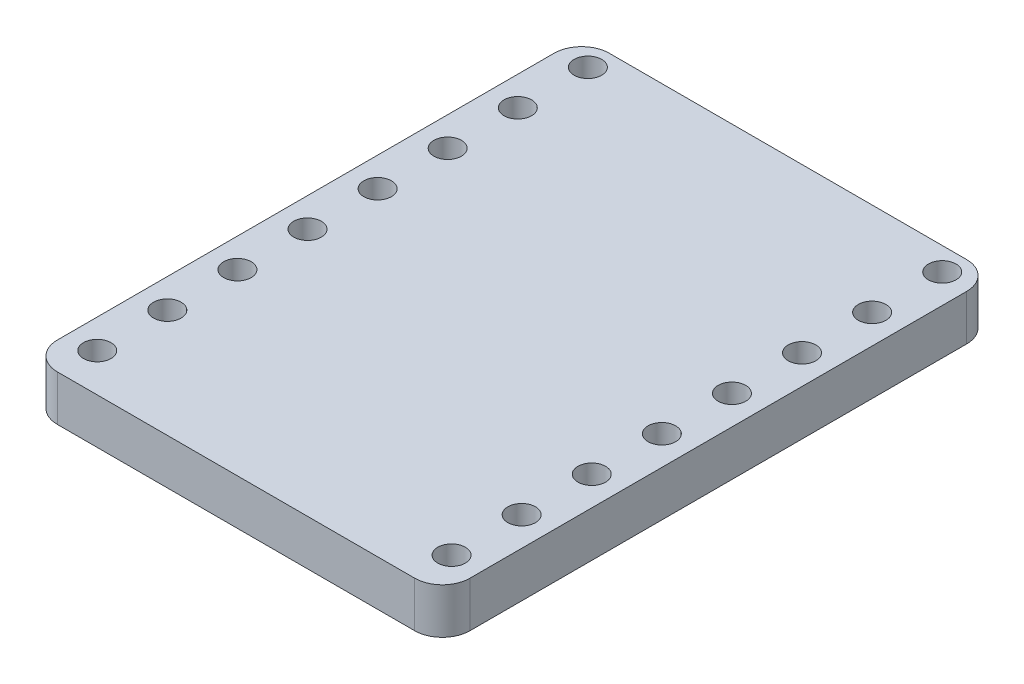
ISO-10303-21;
HEADER;
FILE_DESCRIPTION(('STEP AP214'),'2;1');
FILE_NAME('part.step','',(''),(''),'','','');
FILE_SCHEMA(('AUTOMOTIVE_DESIGN { 1 0 10303 214 1 1 1 1 }'));
ENDSEC;
DATA;
#1=APPLICATION_CONTEXT('core data for automotive mechanical design processes');
#2=APPLICATION_PROTOCOL_DEFINITION('international standard','automotive_design',2000,#1);
#3=PRODUCT_CONTEXT('',#1,'mechanical');
#4=PRODUCT('Part','Part','',(#3));
#5=PRODUCT_RELATED_PRODUCT_CATEGORY('part','',(#4));
#6=PRODUCT_DEFINITION_FORMATION('','',#4);
#7=PRODUCT_DEFINITION_CONTEXT('part definition',#1,'design');
#8=PRODUCT_DEFINITION('design','',#6,#7);
#9=PRODUCT_DEFINITION_SHAPE('','',#8);
#10=(LENGTH_UNIT() NAMED_UNIT(*) SI_UNIT(.MILLI.,.METRE.));
#11=(NAMED_UNIT(*) PLANE_ANGLE_UNIT() SI_UNIT($,.RADIAN.));
#12=(NAMED_UNIT(*) SI_UNIT($,.STERADIAN.) SOLID_ANGLE_UNIT());
#13=UNCERTAINTY_MEASURE_WITH_UNIT(LENGTH_MEASURE(1.E-05),#10,'distance_accuracy_value','');
#14=(GEOMETRIC_REPRESENTATION_CONTEXT(3) GLOBAL_UNCERTAINTY_ASSIGNED_CONTEXT((#13)) GLOBAL_UNIT_ASSIGNED_CONTEXT((#10,
#11,#12)) REPRESENTATION_CONTEXT('',''));
#15=CARTESIAN_POINT('',(0.,0.,0.));
#16=DIRECTION('',(0.,0.,1.));
#17=DIRECTION('',(1.,0.,0.));
#18=AXIS2_PLACEMENT_3D('',#15,#16,#17);
#19=CARTESIAN_POINT('',(0.,0.825,0.));
#20=DIRECTION('',(0.,1.,0.));
#21=DIRECTION('',(0.,0.,1.));
#22=AXIS2_PLACEMENT_3D('',#19,#20,#21);
#23=PLANE('',#22);
#24=CARTESIAN_POINT('',(6.42,0.825,-8.89));
#25=DIRECTION('',(0.,1.,0.));
#26=DIRECTION('',(0.,0.,1.));
#27=AXIS2_PLACEMENT_3D('',#24,#25,#26);
#28=CIRCLE('',#27,0.500000000000001);
#29=CARTESIAN_POINT('',(6.42,0.825,-8.39));
#30=VERTEX_POINT('',#29);
#31=EDGE_CURVE('E121',#30,#30,#28,.T.);
#32=ORIENTED_EDGE('',*,*,#31,.F.);
#33=EDGE_LOOP('',(#32));
#34=FACE_BOUND('',#33,.T.);
#35=CARTESIAN_POINT('',(6.42,0.825,-6.35));
#36=DIRECTION('',(0.,1.,0.));
#37=DIRECTION('',(0.,0.,1.));
#38=AXIS2_PLACEMENT_3D('',#35,#36,#37);
#39=CIRCLE('',#38,0.500000000000001);
#40=CARTESIAN_POINT('',(6.42,0.825,-5.85));
#41=VERTEX_POINT('',#40);
#42=EDGE_CURVE('E255',#41,#41,#39,.T.);
#43=ORIENTED_EDGE('',*,*,#42,.F.);
#44=EDGE_LOOP('',(#43));
#45=FACE_BOUND('',#44,.T.);
#46=CARTESIAN_POINT('',(6.42,0.825,-3.81));
#47=DIRECTION('',(0.,1.,0.));
#48=DIRECTION('',(0.,0.,1.));
#49=AXIS2_PLACEMENT_3D('',#46,#47,#48);
#50=CIRCLE('',#49,0.500000000000001);
#51=CARTESIAN_POINT('',(6.42,0.825,-3.31));
#52=VERTEX_POINT('',#51);
#53=EDGE_CURVE('E249',#52,#52,#50,.T.);
#54=ORIENTED_EDGE('',*,*,#53,.F.);
#55=EDGE_LOOP('',(#54));
#56=FACE_BOUND('',#55,.T.);
#57=CARTESIAN_POINT('',(6.42,0.825,-1.27));
#58=DIRECTION('',(0.,1.,0.));
#59=DIRECTION('',(0.,0.,1.));
#60=AXIS2_PLACEMENT_3D('',#57,#58,#59);
#61=CIRCLE('',#60,0.500000000000001);
#62=CARTESIAN_POINT('',(6.42,0.825,-0.769999999999999));
#63=VERTEX_POINT('',#62);
#64=EDGE_CURVE('E243',#63,#63,#61,.T.);
#65=ORIENTED_EDGE('',*,*,#64,.F.);
#66=EDGE_LOOP('',(#65));
#67=FACE_BOUND('',#66,.T.);
#68=CARTESIAN_POINT('',(6.42,0.825,1.27));
#69=DIRECTION('',(0.,1.,0.));
#70=DIRECTION('',(0.,0.,1.));
#71=AXIS2_PLACEMENT_3D('',#68,#69,#70);
#72=CIRCLE('',#71,0.500000000000001);
#73=CARTESIAN_POINT('',(6.42,0.825,1.77));
#74=VERTEX_POINT('',#73);
#75=EDGE_CURVE('E237',#74,#74,#72,.T.);
#76=ORIENTED_EDGE('',*,*,#75,.F.);
#77=EDGE_LOOP('',(#76));
#78=FACE_BOUND('',#77,.T.);
#79=CARTESIAN_POINT('',(6.42,0.825,3.81));
#80=DIRECTION('',(0.,1.,0.));
#81=DIRECTION('',(0.,0.,1.));
#82=AXIS2_PLACEMENT_3D('',#79,#80,#81);
#83=CIRCLE('',#82,0.500000000000001);
#84=CARTESIAN_POINT('',(6.42,0.825,4.31));
#85=VERTEX_POINT('',#84);
#86=EDGE_CURVE('E231',#85,#85,#83,.T.);
#87=ORIENTED_EDGE('',*,*,#86,.F.);
#88=EDGE_LOOP('',(#87));
#89=FACE_BOUND('',#88,.T.);
#90=CARTESIAN_POINT('',(6.42,0.825,6.35));
#91=DIRECTION('',(0.,1.,0.));
#92=DIRECTION('',(0.,0.,1.));
#93=AXIS2_PLACEMENT_3D('',#90,#91,#92);
#94=CIRCLE('',#93,0.500000000000001);
#95=CARTESIAN_POINT('',(6.42,0.825,6.85));
#96=VERTEX_POINT('',#95);
#97=EDGE_CURVE('E225',#96,#96,#94,.T.);
#98=ORIENTED_EDGE('',*,*,#97,.F.);
#99=EDGE_LOOP('',(#98));
#100=FACE_BOUND('',#99,.T.);
#101=CARTESIAN_POINT('',(6.42,0.825,8.89));
#102=DIRECTION('',(0.,1.,0.));
#103=DIRECTION('',(0.,0.,1.));
#104=AXIS2_PLACEMENT_3D('',#101,#102,#103);
#105=CIRCLE('',#104,0.500000000000001);
#106=CARTESIAN_POINT('',(6.42,0.825,9.39));
#107=VERTEX_POINT('',#106);
#108=EDGE_CURVE('E219',#107,#107,#105,.T.);
#109=ORIENTED_EDGE('',*,*,#108,.F.);
#110=EDGE_LOOP('',(#109));
#111=FACE_BOUND('',#110,.T.);
#112=CARTESIAN_POINT('',(-6.42,0.825,-8.89));
#113=DIRECTION('',(0.,1.,0.));
#114=DIRECTION('',(0.,0.,1.));
#115=AXIS2_PLACEMENT_3D('',#112,#113,#114);
#116=CIRCLE('',#115,0.500000000000001);
#117=CARTESIAN_POINT('',(-6.42,0.825,-8.39));
#118=VERTEX_POINT('',#117);
#119=EDGE_CURVE('E213',#118,#118,#116,.T.);
#120=ORIENTED_EDGE('',*,*,#119,.F.);
#121=EDGE_LOOP('',(#120));
#122=FACE_BOUND('',#121,.T.);
#123=CARTESIAN_POINT('',(-6.42,0.825,-6.35));
#124=DIRECTION('',(0.,1.,0.));
#125=DIRECTION('',(0.,0.,1.));
#126=AXIS2_PLACEMENT_3D('',#123,#124,#125);
#127=CIRCLE('',#126,0.500000000000001);
#128=CARTESIAN_POINT('',(-6.42,0.825,-5.85));
#129=VERTEX_POINT('',#128);
#130=EDGE_CURVE('E207',#129,#129,#127,.T.);
#131=ORIENTED_EDGE('',*,*,#130,.F.);
#132=EDGE_LOOP('',(#131));
#133=FACE_BOUND('',#132,.T.);
#134=CARTESIAN_POINT('',(-6.42,0.825,-3.81));
#135=DIRECTION('',(0.,1.,0.));
#136=DIRECTION('',(0.,0.,1.));
#137=AXIS2_PLACEMENT_3D('',#134,#135,#136);
#138=CIRCLE('',#137,0.500000000000001);
#139=CARTESIAN_POINT('',(-6.42,0.825,-3.31));
#140=VERTEX_POINT('',#139);
#141=EDGE_CURVE('E201',#140,#140,#138,.T.);
#142=ORIENTED_EDGE('',*,*,#141,.F.);
#143=EDGE_LOOP('',(#142));
#144=FACE_BOUND('',#143,.T.);
#145=CARTESIAN_POINT('',(-6.42,0.825,-1.27));
#146=DIRECTION('',(0.,1.,0.));
#147=DIRECTION('',(0.,0.,1.));
#148=AXIS2_PLACEMENT_3D('',#145,#146,#147);
#149=CIRCLE('',#148,0.500000000000001);
#150=CARTESIAN_POINT('',(-6.42,0.825,-0.770000000000001));
#151=VERTEX_POINT('',#150);
#152=EDGE_CURVE('E195',#151,#151,#149,.T.);
#153=ORIENTED_EDGE('',*,*,#152,.F.);
#154=EDGE_LOOP('',(#153));
#155=FACE_BOUND('',#154,.T.);
#156=CARTESIAN_POINT('',(-6.42,0.825,1.27));
#157=DIRECTION('',(0.,1.,0.));
#158=DIRECTION('',(0.,0.,1.));
#159=AXIS2_PLACEMENT_3D('',#156,#157,#158);
#160=CIRCLE('',#159,0.500000000000001);
#161=CARTESIAN_POINT('',(-6.42,0.825,1.77));
#162=VERTEX_POINT('',#161);
#163=EDGE_CURVE('E189',#162,#162,#160,.T.);
#164=ORIENTED_EDGE('',*,*,#163,.F.);
#165=EDGE_LOOP('',(#164));
#166=FACE_BOUND('',#165,.T.);
#167=CARTESIAN_POINT('',(-6.42,0.825,3.81));
#168=DIRECTION('',(0.,1.,0.));
#169=DIRECTION('',(0.,0.,1.));
#170=AXIS2_PLACEMENT_3D('',#167,#168,#169);
#171=CIRCLE('',#170,0.500000000000001);
#172=CARTESIAN_POINT('',(-6.42,0.825,4.31));
#173=VERTEX_POINT('',#172);
#174=EDGE_CURVE('E183',#173,#173,#171,.T.);
#175=ORIENTED_EDGE('',*,*,#174,.F.);
#176=EDGE_LOOP('',(#175));
#177=FACE_BOUND('',#176,.T.);
#178=CARTESIAN_POINT('',(-6.42,0.825,8.89));
#179=DIRECTION('',(0.,1.,0.));
#180=DIRECTION('',(0.,0.,1.));
#181=AXIS2_PLACEMENT_3D('',#178,#179,#180);
#182=CIRCLE('',#181,0.500000000000001);
#183=CARTESIAN_POINT('',(-6.42,0.825,9.39));
#184=VERTEX_POINT('',#183);
#185=EDGE_CURVE('E174',#184,#184,#182,.T.);
#186=ORIENTED_EDGE('',*,*,#185,.F.);
#187=EDGE_LOOP('',(#186));
#188=FACE_BOUND('',#187,.T.);
#189=CARTESIAN_POINT('',(-6.42,0.825,6.35));
#190=DIRECTION('',(0.,1.,0.));
#191=DIRECTION('',(0.,0.,1.));
#192=AXIS2_PLACEMENT_3D('',#189,#190,#191);
#193=CIRCLE('',#192,0.500000000000001);
#194=CARTESIAN_POINT('',(-6.42,0.825,6.85));
#195=VERTEX_POINT('',#194);
#196=EDGE_CURVE('E171',#195,#195,#193,.T.);
#197=ORIENTED_EDGE('',*,*,#196,.F.);
#198=EDGE_LOOP('',(#197));
#199=FACE_BOUND('',#198,.T.);
#200=DIRECTION('',(1.,0.,0.));
#201=VECTOR('',#200,1.);
#202=CARTESIAN_POINT('',(-7.475,0.825,10.28));
#203=LINE('',#202,#201);
#204=CARTESIAN_POINT('',(-6.475,0.825,10.28));
#205=VERTEX_POINT('',#204);
#206=CARTESIAN_POINT('',(6.47499999999999,0.825,10.28));
#207=VERTEX_POINT('',#206);
#208=EDGE_CURVE('E100',#205,#207,#203,.T.);
#209=ORIENTED_EDGE('',*,*,#208,.T.);
#210=CARTESIAN_POINT('',(6.475,0.825,9.28));
#211=DIRECTION('',(0.,1.,0.));
#212=DIRECTION('',(0.,0.,1.));
#213=AXIS2_PLACEMENT_3D('',#210,#211,#212);
#214=CIRCLE('',#213,1.);
#215=CARTESIAN_POINT('',(7.475,0.825,9.28));
#216=VERTEX_POINT('',#215);
#217=EDGE_CURVE('E132',#207,#216,#214,.T.);
#218=ORIENTED_EDGE('',*,*,#217,.T.);
#219=DIRECTION('',(0.,0.,-1.));
#220=VECTOR('',#219,1.);
#221=CARTESIAN_POINT('',(7.475,0.825,-9.72));
#222=LINE('',#221,#220);
#223=CARTESIAN_POINT('',(7.475,0.825,-8.72));
#224=VERTEX_POINT('',#223);
#225=EDGE_CURVE('E117',#216,#224,#222,.T.);
#226=ORIENTED_EDGE('',*,*,#225,.T.);
#227=CARTESIAN_POINT('',(6.475,0.825,-8.72));
#228=DIRECTION('',(0.,1.,0.));
#229=DIRECTION('',(0.,0.,1.));
#230=AXIS2_PLACEMENT_3D('',#227,#228,#229);
#231=CIRCLE('',#230,1.);
#232=CARTESIAN_POINT('',(6.475,0.825,-9.72));
#233=VERTEX_POINT('',#232);
#234=EDGE_CURVE('E130',#224,#233,#231,.T.);
#235=ORIENTED_EDGE('',*,*,#234,.T.);
#236=DIRECTION('',(-1.,0.,0.));
#237=VECTOR('',#236,1.);
#238=CARTESIAN_POINT('',(-7.475,0.825,-9.72));
#239=LINE('',#238,#237);
#240=CARTESIAN_POINT('',(-6.475,0.825,-9.72));
#241=VERTEX_POINT('',#240);
#242=EDGE_CURVE('E154',#233,#241,#239,.T.);
#243=ORIENTED_EDGE('',*,*,#242,.T.);
#244=CARTESIAN_POINT('',(-6.475,0.825,-8.72));
#245=DIRECTION('',(0.,1.,0.));
#246=DIRECTION('',(0.,0.,1.));
#247=AXIS2_PLACEMENT_3D('',#244,#245,#246);
#248=CIRCLE('',#247,1.);
#249=CARTESIAN_POINT('',(-7.475,0.825,-8.72));
#250=VERTEX_POINT('',#249);
#251=EDGE_CURVE('E107',#241,#250,#248,.T.);
#252=ORIENTED_EDGE('',*,*,#251,.T.);
#253=DIRECTION('',(0.,0.,1.));
#254=VECTOR('',#253,1.);
#255=CARTESIAN_POINT('',(-7.475,0.825,-9.72));
#256=LINE('',#255,#254);
#257=CARTESIAN_POINT('',(-7.475,0.825,9.28));
#258=VERTEX_POINT('',#257);
#259=EDGE_CURVE('E102',#250,#258,#256,.T.);
#260=ORIENTED_EDGE('',*,*,#259,.T.);
#261=CARTESIAN_POINT('',(-6.475,0.825,9.28));
#262=DIRECTION('',(0.,1.,0.));
#263=DIRECTION('',(0.,0.,1.));
#264=AXIS2_PLACEMENT_3D('',#261,#262,#263);
#265=CIRCLE('',#264,1.);
#266=EDGE_CURVE('E98',#258,#205,#265,.T.);
#267=ORIENTED_EDGE('',*,*,#266,.T.);
#268=EDGE_LOOP('',(#209,#218,#226,#235,#243,#252,#260,#267));
#269=FACE_BOUND('',#268,.T.);
#270=ADVANCED_FACE('F32',(#34,#45,#56,#67,#78,#89,#100,#111,#122,#133,#144,#155,#166,#177,#188,
#199,#269),#23,.T.);
#271=CARTESIAN_POINT('',(0.,-0.825,0.));
#272=DIRECTION('',(0.,1.,0.));
#273=DIRECTION('',(0.,0.,1.));
#274=AXIS2_PLACEMENT_3D('',#271,#272,#273);
#275=PLANE('',#274);
#276=CARTESIAN_POINT('',(6.42,-0.825,-8.89));
#277=DIRECTION('',(0.,1.,0.));
#278=DIRECTION('',(0.,0.,1.));
#279=AXIS2_PLACEMENT_3D('',#276,#277,#278);
#280=CIRCLE('',#279,0.500000000000001);
#281=CARTESIAN_POINT('',(6.42,-0.825,-8.39));
#282=VERTEX_POINT('',#281);
#283=EDGE_CURVE('E125',#282,#282,#280,.T.);
#284=ORIENTED_EDGE('',*,*,#283,.T.);
#285=EDGE_LOOP('',(#284));
#286=FACE_BOUND('',#285,.T.);
#287=CARTESIAN_POINT('',(6.42,-0.825,-6.35));
#288=DIRECTION('',(0.,1.,0.));
#289=DIRECTION('',(0.,0.,1.));
#290=AXIS2_PLACEMENT_3D('',#287,#288,#289);
#291=CIRCLE('',#290,0.500000000000001);
#292=CARTESIAN_POINT('',(6.42,-0.825,-5.85));
#293=VERTEX_POINT('',#292);
#294=EDGE_CURVE('E252',#293,#293,#291,.T.);
#295=ORIENTED_EDGE('',*,*,#294,.T.);
#296=EDGE_LOOP('',(#295));
#297=FACE_BOUND('',#296,.T.);
#298=CARTESIAN_POINT('',(6.42,-0.825,-3.81));
#299=DIRECTION('',(0.,1.,0.));
#300=DIRECTION('',(0.,0.,1.));
#301=AXIS2_PLACEMENT_3D('',#298,#299,#300);
#302=CIRCLE('',#301,0.500000000000001);
#303=CARTESIAN_POINT('',(6.42,-0.825,-3.31));
#304=VERTEX_POINT('',#303);
#305=EDGE_CURVE('E246',#304,#304,#302,.T.);
#306=ORIENTED_EDGE('',*,*,#305,.T.);
#307=EDGE_LOOP('',(#306));
#308=FACE_BOUND('',#307,.T.);
#309=CARTESIAN_POINT('',(6.42,-0.825,-1.27));
#310=DIRECTION('',(0.,1.,0.));
#311=DIRECTION('',(0.,0.,1.));
#312=AXIS2_PLACEMENT_3D('',#309,#310,#311);
#313=CIRCLE('',#312,0.500000000000001);
#314=CARTESIAN_POINT('',(6.42,-0.825,-0.769999999999999));
#315=VERTEX_POINT('',#314);
#316=EDGE_CURVE('E240',#315,#315,#313,.T.);
#317=ORIENTED_EDGE('',*,*,#316,.T.);
#318=EDGE_LOOP('',(#317));
#319=FACE_BOUND('',#318,.T.);
#320=CARTESIAN_POINT('',(6.42,-0.825,1.27));
#321=DIRECTION('',(0.,1.,0.));
#322=DIRECTION('',(0.,0.,1.));
#323=AXIS2_PLACEMENT_3D('',#320,#321,#322);
#324=CIRCLE('',#323,0.500000000000001);
#325=CARTESIAN_POINT('',(6.42,-0.825,1.77));
#326=VERTEX_POINT('',#325);
#327=EDGE_CURVE('E234',#326,#326,#324,.T.);
#328=ORIENTED_EDGE('',*,*,#327,.T.);
#329=EDGE_LOOP('',(#328));
#330=FACE_BOUND('',#329,.T.);
#331=CARTESIAN_POINT('',(6.42,-0.825,3.81));
#332=DIRECTION('',(0.,1.,0.));
#333=DIRECTION('',(0.,0.,1.));
#334=AXIS2_PLACEMENT_3D('',#331,#332,#333);
#335=CIRCLE('',#334,0.500000000000001);
#336=CARTESIAN_POINT('',(6.42,-0.825,4.31));
#337=VERTEX_POINT('',#336);
#338=EDGE_CURVE('E228',#337,#337,#335,.T.);
#339=ORIENTED_EDGE('',*,*,#338,.T.);
#340=EDGE_LOOP('',(#339));
#341=FACE_BOUND('',#340,.T.);
#342=CARTESIAN_POINT('',(6.42,-0.825,6.35));
#343=DIRECTION('',(0.,1.,0.));
#344=DIRECTION('',(0.,0.,1.));
#345=AXIS2_PLACEMENT_3D('',#342,#343,#344);
#346=CIRCLE('',#345,0.500000000000001);
#347=CARTESIAN_POINT('',(6.42,-0.825,6.85));
#348=VERTEX_POINT('',#347);
#349=EDGE_CURVE('E222',#348,#348,#346,.T.);
#350=ORIENTED_EDGE('',*,*,#349,.T.);
#351=EDGE_LOOP('',(#350));
#352=FACE_BOUND('',#351,.T.);
#353=CARTESIAN_POINT('',(6.42,-0.825,8.89));
#354=DIRECTION('',(0.,1.,0.));
#355=DIRECTION('',(0.,0.,1.));
#356=AXIS2_PLACEMENT_3D('',#353,#354,#355);
#357=CIRCLE('',#356,0.500000000000001);
#358=CARTESIAN_POINT('',(6.42,-0.825,9.39));
#359=VERTEX_POINT('',#358);
#360=EDGE_CURVE('E216',#359,#359,#357,.T.);
#361=ORIENTED_EDGE('',*,*,#360,.T.);
#362=EDGE_LOOP('',(#361));
#363=FACE_BOUND('',#362,.T.);
#364=CARTESIAN_POINT('',(-6.42,-0.825,-8.89));
#365=DIRECTION('',(0.,1.,0.));
#366=DIRECTION('',(0.,0.,1.));
#367=AXIS2_PLACEMENT_3D('',#364,#365,#366);
#368=CIRCLE('',#367,0.500000000000001);
#369=CARTESIAN_POINT('',(-6.42,-0.825,-8.39));
#370=VERTEX_POINT('',#369);
#371=EDGE_CURVE('E210',#370,#370,#368,.T.);
#372=ORIENTED_EDGE('',*,*,#371,.T.);
#373=EDGE_LOOP('',(#372));
#374=FACE_BOUND('',#373,.T.);
#375=CARTESIAN_POINT('',(-6.42,-0.825,-6.35));
#376=DIRECTION('',(0.,1.,0.));
#377=DIRECTION('',(0.,0.,1.));
#378=AXIS2_PLACEMENT_3D('',#375,#376,#377);
#379=CIRCLE('',#378,0.500000000000001);
#380=CARTESIAN_POINT('',(-6.42,-0.825,-5.85));
#381=VERTEX_POINT('',#380);
#382=EDGE_CURVE('E204',#381,#381,#379,.T.);
#383=ORIENTED_EDGE('',*,*,#382,.T.);
#384=EDGE_LOOP('',(#383));
#385=FACE_BOUND('',#384,.T.);
#386=CARTESIAN_POINT('',(-6.42,-0.825,-3.81));
#387=DIRECTION('',(0.,1.,0.));
#388=DIRECTION('',(0.,0.,1.));
#389=AXIS2_PLACEMENT_3D('',#386,#387,#388);
#390=CIRCLE('',#389,0.500000000000001);
#391=CARTESIAN_POINT('',(-6.42,-0.825,-3.31));
#392=VERTEX_POINT('',#391);
#393=EDGE_CURVE('E198',#392,#392,#390,.T.);
#394=ORIENTED_EDGE('',*,*,#393,.T.);
#395=EDGE_LOOP('',(#394));
#396=FACE_BOUND('',#395,.T.);
#397=CARTESIAN_POINT('',(-6.42,-0.825,-1.27));
#398=DIRECTION('',(0.,1.,0.));
#399=DIRECTION('',(0.,0.,1.));
#400=AXIS2_PLACEMENT_3D('',#397,#398,#399);
#401=CIRCLE('',#400,0.500000000000001);
#402=CARTESIAN_POINT('',(-6.42,-0.825,-0.770000000000001));
#403=VERTEX_POINT('',#402);
#404=EDGE_CURVE('E192',#403,#403,#401,.T.);
#405=ORIENTED_EDGE('',*,*,#404,.T.);
#406=EDGE_LOOP('',(#405));
#407=FACE_BOUND('',#406,.T.);
#408=CARTESIAN_POINT('',(-6.42,-0.825,1.27));
#409=DIRECTION('',(0.,1.,0.));
#410=DIRECTION('',(0.,0.,1.));
#411=AXIS2_PLACEMENT_3D('',#408,#409,#410);
#412=CIRCLE('',#411,0.500000000000001);
#413=CARTESIAN_POINT('',(-6.42,-0.825,1.77));
#414=VERTEX_POINT('',#413);
#415=EDGE_CURVE('E186',#414,#414,#412,.T.);
#416=ORIENTED_EDGE('',*,*,#415,.T.);
#417=EDGE_LOOP('',(#416));
#418=FACE_BOUND('',#417,.T.);
#419=CARTESIAN_POINT('',(-6.42,-0.825,3.81));
#420=DIRECTION('',(0.,1.,0.));
#421=DIRECTION('',(0.,0.,1.));
#422=AXIS2_PLACEMENT_3D('',#419,#420,#421);
#423=CIRCLE('',#422,0.500000000000001);
#424=CARTESIAN_POINT('',(-6.42,-0.825,4.31));
#425=VERTEX_POINT('',#424);
#426=EDGE_CURVE('E180',#425,#425,#423,.T.);
#427=ORIENTED_EDGE('',*,*,#426,.T.);
#428=EDGE_LOOP('',(#427));
#429=FACE_BOUND('',#428,.T.);
#430=CARTESIAN_POINT('',(-6.42,-0.825,8.89));
#431=DIRECTION('',(0.,1.,0.));
#432=DIRECTION('',(0.,0.,1.));
#433=AXIS2_PLACEMENT_3D('',#430,#431,#432);
#434=CIRCLE('',#433,0.500000000000001);
#435=CARTESIAN_POINT('',(-6.42,-0.825,9.39));
#436=VERTEX_POINT('',#435);
#437=EDGE_CURVE('E177',#436,#436,#434,.T.);
#438=ORIENTED_EDGE('',*,*,#437,.T.);
#439=EDGE_LOOP('',(#438));
#440=FACE_BOUND('',#439,.T.);
#441=CARTESIAN_POINT('',(-6.42,-0.825,6.35));
#442=DIRECTION('',(0.,1.,0.));
#443=DIRECTION('',(0.,0.,1.));
#444=AXIS2_PLACEMENT_3D('',#441,#442,#443);
#445=CIRCLE('',#444,0.500000000000001);
#446=CARTESIAN_POINT('',(-6.42,-0.825,6.85));
#447=VERTEX_POINT('',#446);
#448=EDGE_CURVE('E165',#447,#447,#445,.T.);
#449=ORIENTED_EDGE('',*,*,#448,.T.);
#450=EDGE_LOOP('',(#449));
#451=FACE_BOUND('',#450,.T.);
#452=DIRECTION('',(0.,0.,-1.));
#453=VECTOR('',#452,1.);
#454=CARTESIAN_POINT('',(7.475,-0.825,-9.72));
#455=LINE('',#454,#453);
#456=CARTESIAN_POINT('',(7.475,-0.825,9.28));
#457=VERTEX_POINT('',#456);
#458=CARTESIAN_POINT('',(7.475,-0.825,-8.72));
#459=VERTEX_POINT('',#458);
#460=EDGE_CURVE('E156',#457,#459,#455,.T.);
#461=ORIENTED_EDGE('',*,*,#460,.F.);
#462=CARTESIAN_POINT('',(6.475,-0.825,9.28));
#463=DIRECTION('',(0.,1.,0.));
#464=DIRECTION('',(0.,0.,1.));
#465=AXIS2_PLACEMENT_3D('',#462,#463,#464);
#466=CIRCLE('',#465,1.);
#467=CARTESIAN_POINT('',(6.47499999999999,-0.825,10.28));
#468=VERTEX_POINT('',#467);
#469=EDGE_CURVE('E143',#457,#468,#466,.F.);
#470=ORIENTED_EDGE('',*,*,#469,.T.);
#471=DIRECTION('',(1.,0.,0.));
#472=VECTOR('',#471,1.);
#473=CARTESIAN_POINT('',(-7.475,-0.825,10.28));
#474=LINE('',#473,#472);
#475=CARTESIAN_POINT('',(-6.475,-0.825,10.28));
#476=VERTEX_POINT('',#475);
#477=EDGE_CURVE('E153',#476,#468,#474,.T.);
#478=ORIENTED_EDGE('',*,*,#477,.F.);
#479=CARTESIAN_POINT('',(-6.475,-0.825,9.28));
#480=DIRECTION('',(0.,1.,0.));
#481=DIRECTION('',(0.,0.,1.));
#482=AXIS2_PLACEMENT_3D('',#479,#480,#481);
#483=CIRCLE('',#482,1.);
#484=CARTESIAN_POINT('',(-7.475,-0.825,9.28));
#485=VERTEX_POINT('',#484);
#486=EDGE_CURVE('E120',#476,#485,#483,.F.);
#487=ORIENTED_EDGE('',*,*,#486,.T.);
#488=DIRECTION('',(0.,0.,1.));
#489=VECTOR('',#488,1.);
#490=CARTESIAN_POINT('',(-7.475,-0.825,-9.72));
#491=LINE('',#490,#489);
#492=CARTESIAN_POINT('',(-7.475,-0.825,-8.72));
#493=VERTEX_POINT('',#492);
#494=EDGE_CURVE('E152',#493,#485,#491,.T.);
#495=ORIENTED_EDGE('',*,*,#494,.F.);
#496=CARTESIAN_POINT('',(-6.475,-0.825,-8.72));
#497=DIRECTION('',(0.,1.,0.));
#498=DIRECTION('',(0.,0.,1.));
#499=AXIS2_PLACEMENT_3D('',#496,#497,#498);
#500=CIRCLE('',#499,1.);
#501=CARTESIAN_POINT('',(-6.475,-0.825,-9.72));
#502=VERTEX_POINT('',#501);
#503=EDGE_CURVE('E47',#493,#502,#500,.F.);
#504=ORIENTED_EDGE('',*,*,#503,.T.);
#505=DIRECTION('',(-1.,0.,0.));
#506=VECTOR('',#505,1.);
#507=CARTESIAN_POINT('',(-7.475,-0.825,-9.72));
#508=LINE('',#507,#506);
#509=CARTESIAN_POINT('',(6.475,-0.825,-9.72));
#510=VERTEX_POINT('',#509);
#511=EDGE_CURVE('E163',#510,#502,#508,.T.);
#512=ORIENTED_EDGE('',*,*,#511,.F.);
#513=CARTESIAN_POINT('',(6.475,-0.825,-8.72));
#514=DIRECTION('',(0.,1.,0.));
#515=DIRECTION('',(0.,0.,1.));
#516=AXIS2_PLACEMENT_3D('',#513,#514,#515);
#517=CIRCLE('',#516,1.);
#518=EDGE_CURVE('E141',#510,#459,#517,.F.);
#519=ORIENTED_EDGE('',*,*,#518,.T.);
#520=EDGE_LOOP('',(#461,#470,#478,#487,#495,#504,#512,#519));
#521=FACE_BOUND('',#520,.T.);
#522=ADVANCED_FACE('F260',(#286,#297,#308,#319,#330,#341,#352,#363,#374,#385,#396,#407,#418,
#429,#440,#451,#521),#275,.F.);
#523=CARTESIAN_POINT('',(6.42,-0.825,-8.89));
#524=DIRECTION('',(0.,1.,0.));
#525=DIRECTION('',(0.,0.,1.));
#526=AXIS2_PLACEMENT_3D('',#523,#524,#525);
#527=CYLINDRICAL_SURFACE('',#526,0.500000000000001);
#528=ORIENTED_EDGE('',*,*,#283,.F.);
#529=EDGE_LOOP('',(#528));
#530=FACE_BOUND('',#529,.T.);
#531=ORIENTED_EDGE('',*,*,#31,.T.);
#532=EDGE_LOOP('',(#531));
#533=FACE_BOUND('',#532,.T.);
#534=ADVANCED_FACE('F263',(#530,#533),#527,.F.);
#535=CARTESIAN_POINT('',(6.42,-0.825,-6.35));
#536=DIRECTION('',(0.,1.,0.));
#537=DIRECTION('',(0.,0.,1.));
#538=AXIS2_PLACEMENT_3D('',#535,#536,#537);
#539=CYLINDRICAL_SURFACE('',#538,0.500000000000001);
#540=ORIENTED_EDGE('',*,*,#294,.F.);
#541=EDGE_LOOP('',(#540));
#542=FACE_BOUND('',#541,.T.);
#543=ORIENTED_EDGE('',*,*,#42,.T.);
#544=EDGE_LOOP('',(#543));
#545=FACE_BOUND('',#544,.T.);
#546=ADVANCED_FACE('F266',(#542,#545),#539,.F.);
#547=CARTESIAN_POINT('',(6.42,-0.825,-3.81));
#548=DIRECTION('',(0.,1.,0.));
#549=DIRECTION('',(0.,0.,1.));
#550=AXIS2_PLACEMENT_3D('',#547,#548,#549);
#551=CYLINDRICAL_SURFACE('',#550,0.500000000000001);
#552=ORIENTED_EDGE('',*,*,#305,.F.);
#553=EDGE_LOOP('',(#552));
#554=FACE_BOUND('',#553,.T.);
#555=ORIENTED_EDGE('',*,*,#53,.T.);
#556=EDGE_LOOP('',(#555));
#557=FACE_BOUND('',#556,.T.);
#558=ADVANCED_FACE('F364',(#554,#557),#551,.F.);
#559=CARTESIAN_POINT('',(6.42,-0.825,-1.27));
#560=DIRECTION('',(0.,1.,0.));
#561=DIRECTION('',(0.,0.,1.));
#562=AXIS2_PLACEMENT_3D('',#559,#560,#561);
#563=CYLINDRICAL_SURFACE('',#562,0.500000000000001);
#564=ORIENTED_EDGE('',*,*,#316,.F.);
#565=EDGE_LOOP('',(#564));
#566=FACE_BOUND('',#565,.T.);
#567=ORIENTED_EDGE('',*,*,#64,.T.);
#568=EDGE_LOOP('',(#567));
#569=FACE_BOUND('',#568,.T.);
#570=ADVANCED_FACE('F360',(#566,#569),#563,.F.);
#571=CARTESIAN_POINT('',(6.42,-0.825,1.27));
#572=DIRECTION('',(0.,1.,0.));
#573=DIRECTION('',(0.,0.,1.));
#574=AXIS2_PLACEMENT_3D('',#571,#572,#573);
#575=CYLINDRICAL_SURFACE('',#574,0.500000000000001);
#576=ORIENTED_EDGE('',*,*,#327,.F.);
#577=EDGE_LOOP('',(#576));
#578=FACE_BOUND('',#577,.T.);
#579=ORIENTED_EDGE('',*,*,#75,.T.);
#580=EDGE_LOOP('',(#579));
#581=FACE_BOUND('',#580,.T.);
#582=ADVANCED_FACE('F356',(#578,#581),#575,.F.);
#583=CARTESIAN_POINT('',(6.42,-0.825,3.81));
#584=DIRECTION('',(0.,1.,0.));
#585=DIRECTION('',(0.,0.,1.));
#586=AXIS2_PLACEMENT_3D('',#583,#584,#585);
#587=CYLINDRICAL_SURFACE('',#586,0.500000000000001);
#588=ORIENTED_EDGE('',*,*,#338,.F.);
#589=EDGE_LOOP('',(#588));
#590=FACE_BOUND('',#589,.T.);
#591=ORIENTED_EDGE('',*,*,#86,.T.);
#592=EDGE_LOOP('',(#591));
#593=FACE_BOUND('',#592,.T.);
#594=ADVANCED_FACE('F352',(#590,#593),#587,.F.);
#595=CARTESIAN_POINT('',(6.42,-0.825,6.35));
#596=DIRECTION('',(0.,1.,0.));
#597=DIRECTION('',(0.,0.,1.));
#598=AXIS2_PLACEMENT_3D('',#595,#596,#597);
#599=CYLINDRICAL_SURFACE('',#598,0.500000000000001);
#600=ORIENTED_EDGE('',*,*,#349,.F.);
#601=EDGE_LOOP('',(#600));
#602=FACE_BOUND('',#601,.T.);
#603=ORIENTED_EDGE('',*,*,#97,.T.);
#604=EDGE_LOOP('',(#603));
#605=FACE_BOUND('',#604,.T.);
#606=ADVANCED_FACE('F348',(#602,#605),#599,.F.);
#607=CARTESIAN_POINT('',(6.42,-0.825,8.89));
#608=DIRECTION('',(0.,1.,0.));
#609=DIRECTION('',(0.,0.,1.));
#610=AXIS2_PLACEMENT_3D('',#607,#608,#609);
#611=CYLINDRICAL_SURFACE('',#610,0.500000000000001);
#612=ORIENTED_EDGE('',*,*,#360,.F.);
#613=EDGE_LOOP('',(#612));
#614=FACE_BOUND('',#613,.T.);
#615=ORIENTED_EDGE('',*,*,#108,.T.);
#616=EDGE_LOOP('',(#615));
#617=FACE_BOUND('',#616,.T.);
#618=ADVANCED_FACE('F344',(#614,#617),#611,.F.);
#619=CARTESIAN_POINT('',(-6.42,-0.825,-8.89));
#620=DIRECTION('',(0.,1.,0.));
#621=DIRECTION('',(0.,0.,1.));
#622=AXIS2_PLACEMENT_3D('',#619,#620,#621);
#623=CYLINDRICAL_SURFACE('',#622,0.500000000000001);
#624=ORIENTED_EDGE('',*,*,#371,.F.);
#625=EDGE_LOOP('',(#624));
#626=FACE_BOUND('',#625,.T.);
#627=ORIENTED_EDGE('',*,*,#119,.T.);
#628=EDGE_LOOP('',(#627));
#629=FACE_BOUND('',#628,.T.);
#630=ADVANCED_FACE('F340',(#626,#629),#623,.F.);
#631=CARTESIAN_POINT('',(-6.42,-0.825,-6.35));
#632=DIRECTION('',(0.,1.,0.));
#633=DIRECTION('',(0.,0.,1.));
#634=AXIS2_PLACEMENT_3D('',#631,#632,#633);
#635=CYLINDRICAL_SURFACE('',#634,0.500000000000001);
#636=ORIENTED_EDGE('',*,*,#382,.F.);
#637=EDGE_LOOP('',(#636));
#638=FACE_BOUND('',#637,.T.);
#639=ORIENTED_EDGE('',*,*,#130,.T.);
#640=EDGE_LOOP('',(#639));
#641=FACE_BOUND('',#640,.T.);
#642=ADVANCED_FACE('F336',(#638,#641),#635,.F.);
#643=CARTESIAN_POINT('',(-6.42,-0.825,-3.81));
#644=DIRECTION('',(0.,1.,0.));
#645=DIRECTION('',(0.,0.,1.));
#646=AXIS2_PLACEMENT_3D('',#643,#644,#645);
#647=CYLINDRICAL_SURFACE('',#646,0.500000000000001);
#648=ORIENTED_EDGE('',*,*,#393,.F.);
#649=EDGE_LOOP('',(#648));
#650=FACE_BOUND('',#649,.T.);
#651=ORIENTED_EDGE('',*,*,#141,.T.);
#652=EDGE_LOOP('',(#651));
#653=FACE_BOUND('',#652,.T.);
#654=ADVANCED_FACE('F332',(#650,#653),#647,.F.);
#655=CARTESIAN_POINT('',(-6.42,-0.825,-1.27));
#656=DIRECTION('',(0.,1.,0.));
#657=DIRECTION('',(0.,0.,1.));
#658=AXIS2_PLACEMENT_3D('',#655,#656,#657);
#659=CYLINDRICAL_SURFACE('',#658,0.500000000000001);
#660=ORIENTED_EDGE('',*,*,#404,.F.);
#661=EDGE_LOOP('',(#660));
#662=FACE_BOUND('',#661,.T.);
#663=ORIENTED_EDGE('',*,*,#152,.T.);
#664=EDGE_LOOP('',(#663));
#665=FACE_BOUND('',#664,.T.);
#666=ADVANCED_FACE('F328',(#662,#665),#659,.F.);
#667=CARTESIAN_POINT('',(-6.42,-0.825,1.27));
#668=DIRECTION('',(0.,1.,0.));
#669=DIRECTION('',(0.,0.,1.));
#670=AXIS2_PLACEMENT_3D('',#667,#668,#669);
#671=CYLINDRICAL_SURFACE('',#670,0.500000000000001);
#672=ORIENTED_EDGE('',*,*,#415,.F.);
#673=EDGE_LOOP('',(#672));
#674=FACE_BOUND('',#673,.T.);
#675=ORIENTED_EDGE('',*,*,#163,.T.);
#676=EDGE_LOOP('',(#675));
#677=FACE_BOUND('',#676,.T.);
#678=ADVANCED_FACE('F324',(#674,#677),#671,.F.);
#679=CARTESIAN_POINT('',(-6.42,-0.825,3.81));
#680=DIRECTION('',(0.,1.,0.));
#681=DIRECTION('',(0.,0.,1.));
#682=AXIS2_PLACEMENT_3D('',#679,#680,#681);
#683=CYLINDRICAL_SURFACE('',#682,0.500000000000001);
#684=ORIENTED_EDGE('',*,*,#426,.F.);
#685=EDGE_LOOP('',(#684));
#686=FACE_BOUND('',#685,.T.);
#687=ORIENTED_EDGE('',*,*,#174,.T.);
#688=EDGE_LOOP('',(#687));
#689=FACE_BOUND('',#688,.T.);
#690=ADVANCED_FACE('F314',(#686,#689),#683,.F.);
#691=CARTESIAN_POINT('',(-6.42,-0.825,8.89));
#692=DIRECTION('',(0.,1.,0.));
#693=DIRECTION('',(0.,0.,1.));
#694=AXIS2_PLACEMENT_3D('',#691,#692,#693);
#695=CYLINDRICAL_SURFACE('',#694,0.500000000000001);
#696=ORIENTED_EDGE('',*,*,#437,.F.);
#697=EDGE_LOOP('',(#696));
#698=FACE_BOUND('',#697,.T.);
#699=ORIENTED_EDGE('',*,*,#185,.T.);
#700=EDGE_LOOP('',(#699));
#701=FACE_BOUND('',#700,.T.);
#702=ADVANCED_FACE('F305',(#698,#701),#695,.F.);
#703=CARTESIAN_POINT('',(-6.42,-0.825,6.35));
#704=DIRECTION('',(0.,1.,0.));
#705=DIRECTION('',(0.,0.,1.));
#706=AXIS2_PLACEMENT_3D('',#703,#704,#705);
#707=CYLINDRICAL_SURFACE('',#706,0.500000000000001);
#708=ORIENTED_EDGE('',*,*,#448,.F.);
#709=EDGE_LOOP('',(#708));
#710=FACE_BOUND('',#709,.T.);
#711=ORIENTED_EDGE('',*,*,#196,.T.);
#712=EDGE_LOOP('',(#711));
#713=FACE_BOUND('',#712,.T.);
#714=ADVANCED_FACE('F303',(#710,#713),#707,.F.);
#715=CARTESIAN_POINT('',(-7.475,-0.825,-9.72));
#716=DIRECTION('',(-1.,0.,0.));
#717=DIRECTION('',(0.,0.,1.));
#718=AXIS2_PLACEMENT_3D('',#715,#716,#717);
#719=PLANE('',#718);
#720=ORIENTED_EDGE('',*,*,#259,.F.);
#721=DIRECTION('',(0.,1.,0.));
#722=VECTOR('',#721,1.);
#723=CARTESIAN_POINT('',(-7.475,-0.825,-8.72));
#724=LINE('',#723,#722);
#725=EDGE_CURVE('E11',#250,#493,#724,.F.);
#726=ORIENTED_EDGE('',*,*,#725,.T.);
#727=ORIENTED_EDGE('',*,*,#494,.T.);
#728=DIRECTION('',(0.,1.,0.));
#729=VECTOR('',#728,1.);
#730=CARTESIAN_POINT('',(-7.475,-0.825,9.28));
#731=LINE('',#730,#729);
#732=EDGE_CURVE('E40',#485,#258,#731,.T.);
#733=ORIENTED_EDGE('',*,*,#732,.T.);
#734=EDGE_LOOP('',(#720,#726,#727,#733));
#735=FACE_BOUND('',#734,.T.);
#736=ADVANCED_FACE('F150',(#735),#719,.T.);
#737=CARTESIAN_POINT('',(-7.475,-0.825,-9.72));
#738=DIRECTION('',(0.,0.,-1.));
#739=DIRECTION('',(-1.,0.,0.));
#740=AXIS2_PLACEMENT_3D('',#737,#738,#739);
#741=PLANE('',#740);
#742=ORIENTED_EDGE('',*,*,#242,.F.);
#743=DIRECTION('',(0.,1.,0.));
#744=VECTOR('',#743,1.);
#745=CARTESIAN_POINT('',(6.475,-0.825,-9.72));
#746=LINE('',#745,#744);
#747=EDGE_CURVE('E54',#233,#510,#746,.F.);
#748=ORIENTED_EDGE('',*,*,#747,.T.);
#749=ORIENTED_EDGE('',*,*,#511,.T.);
#750=DIRECTION('',(0.,1.,0.));
#751=VECTOR('',#750,1.);
#752=CARTESIAN_POINT('',(-6.475,-0.825,-9.72));
#753=LINE('',#752,#751);
#754=EDGE_CURVE('E145',#502,#241,#753,.T.);
#755=ORIENTED_EDGE('',*,*,#754,.T.);
#756=EDGE_LOOP('',(#742,#748,#749,#755));
#757=FACE_BOUND('',#756,.T.);
#758=ADVANCED_FACE('F312',(#757),#741,.T.);
#759=CARTESIAN_POINT('',(7.475,-0.825,-9.72));
#760=DIRECTION('',(1.,0.,0.));
#761=DIRECTION('',(0.,0.,-1.));
#762=AXIS2_PLACEMENT_3D('',#759,#760,#761);
#763=PLANE('',#762);
#764=ORIENTED_EDGE('',*,*,#225,.F.);
#765=DIRECTION('',(0.,1.,0.));
#766=VECTOR('',#765,1.);
#767=CARTESIAN_POINT('',(7.475,-0.825,9.28));
#768=LINE('',#767,#766);
#769=EDGE_CURVE('E137',#216,#457,#768,.F.);
#770=ORIENTED_EDGE('',*,*,#769,.T.);
#771=ORIENTED_EDGE('',*,*,#460,.T.);
#772=DIRECTION('',(0.,1.,0.));
#773=VECTOR('',#772,1.);
#774=CARTESIAN_POINT('',(7.475,-0.825,-8.72));
#775=LINE('',#774,#773);
#776=EDGE_CURVE('E134',#459,#224,#775,.T.);
#777=ORIENTED_EDGE('',*,*,#776,.T.);
#778=EDGE_LOOP('',(#764,#770,#771,#777));
#779=FACE_BOUND('',#778,.T.);
#780=ADVANCED_FACE('F390',(#779),#763,.T.);
#781=CARTESIAN_POINT('',(-7.475,-0.825,10.28));
#782=DIRECTION('',(0.,0.,1.));
#783=DIRECTION('',(1.,0.,0.));
#784=AXIS2_PLACEMENT_3D('',#781,#782,#783);
#785=PLANE('',#784);
#786=ORIENTED_EDGE('',*,*,#477,.T.);
#787=DIRECTION('',(0.,1.,0.));
#788=VECTOR('',#787,1.);
#789=CARTESIAN_POINT('',(6.475,-0.825,10.28));
#790=LINE('',#789,#788);
#791=EDGE_CURVE('E108',#468,#207,#790,.T.);
#792=ORIENTED_EDGE('',*,*,#791,.T.);
#793=ORIENTED_EDGE('',*,*,#208,.F.);
#794=DIRECTION('',(0.,1.,0.));
#795=VECTOR('',#794,1.);
#796=CARTESIAN_POINT('',(-6.475,-0.825,10.28));
#797=LINE('',#796,#795);
#798=EDGE_CURVE('E114',#205,#476,#797,.F.);
#799=ORIENTED_EDGE('',*,*,#798,.T.);
#800=EDGE_LOOP('',(#786,#792,#793,#799));
#801=FACE_BOUND('',#800,.T.);
#802=ADVANCED_FACE('F113',(#801),#785,.T.);
#803=CARTESIAN_POINT('',(6.475,-0.825,9.28));
#804=DIRECTION('',(0.,1.,0.));
#805=DIRECTION('',(0.,0.,1.));
#806=AXIS2_PLACEMENT_3D('',#803,#804,#805);
#807=CYLINDRICAL_SURFACE('',#806,1.);
#808=ORIENTED_EDGE('',*,*,#469,.F.);
#809=ORIENTED_EDGE('',*,*,#769,.F.);
#810=ORIENTED_EDGE('',*,*,#217,.F.);
#811=ORIENTED_EDGE('',*,*,#791,.F.);
#812=EDGE_LOOP('',(#808,#809,#810,#811));
#813=FACE_BOUND('',#812,.T.);
#814=ADVANCED_FACE('F372',(#813),#807,.T.);
#815=CARTESIAN_POINT('',(6.475,-0.825,-8.72));
#816=DIRECTION('',(0.,1.,0.));
#817=DIRECTION('',(0.,0.,1.));
#818=AXIS2_PLACEMENT_3D('',#815,#816,#817);
#819=CYLINDRICAL_SURFACE('',#818,1.);
#820=ORIENTED_EDGE('',*,*,#518,.F.);
#821=ORIENTED_EDGE('',*,*,#747,.F.);
#822=ORIENTED_EDGE('',*,*,#234,.F.);
#823=ORIENTED_EDGE('',*,*,#776,.F.);
#824=EDGE_LOOP('',(#820,#821,#822,#823));
#825=FACE_BOUND('',#824,.T.);
#826=ADVANCED_FACE('F375',(#825),#819,.T.);
#827=CARTESIAN_POINT('',(-6.475,-0.825,-8.72));
#828=DIRECTION('',(0.,1.,0.));
#829=DIRECTION('',(0.,0.,1.));
#830=AXIS2_PLACEMENT_3D('',#827,#828,#829);
#831=CYLINDRICAL_SURFACE('',#830,1.);
#832=ORIENTED_EDGE('',*,*,#503,.F.);
#833=ORIENTED_EDGE('',*,*,#725,.F.);
#834=ORIENTED_EDGE('',*,*,#251,.F.);
#835=ORIENTED_EDGE('',*,*,#754,.F.);
#836=EDGE_LOOP('',(#832,#833,#834,#835));
#837=FACE_BOUND('',#836,.T.);
#838=ADVANCED_FACE('F378',(#837),#831,.T.);
#839=CARTESIAN_POINT('',(-6.475,-0.825,9.28));
#840=DIRECTION('',(0.,1.,0.));
#841=DIRECTION('',(0.,0.,1.));
#842=AXIS2_PLACEMENT_3D('',#839,#840,#841);
#843=CYLINDRICAL_SURFACE('',#842,1.);
#844=ORIENTED_EDGE('',*,*,#486,.F.);
#845=ORIENTED_EDGE('',*,*,#798,.F.);
#846=ORIENTED_EDGE('',*,*,#266,.F.);
#847=ORIENTED_EDGE('',*,*,#732,.F.);
#848=EDGE_LOOP('',(#844,#845,#846,#847));
#849=FACE_BOUND('',#848,.T.);
#850=ADVANCED_FACE('F34',(#849),#843,.T.);
#851=CLOSED_SHELL('',(#270,#522,#534,#546,#558,#570,#582,#594,#606,#618,#630,#642,#654,#666,
#678,#690,#702,#714,#736,#758,#780,#802,#814,#826,#838,#850));
#852=MANIFOLD_SOLID_BREP('B2',#851);
#853=ADVANCED_BREP_SHAPE_REPRESENTATION('',(#18,#852),#14);
#854=SHAPE_DEFINITION_REPRESENTATION(#9,#853);
ENDSEC;
END-ISO-10303-21;
